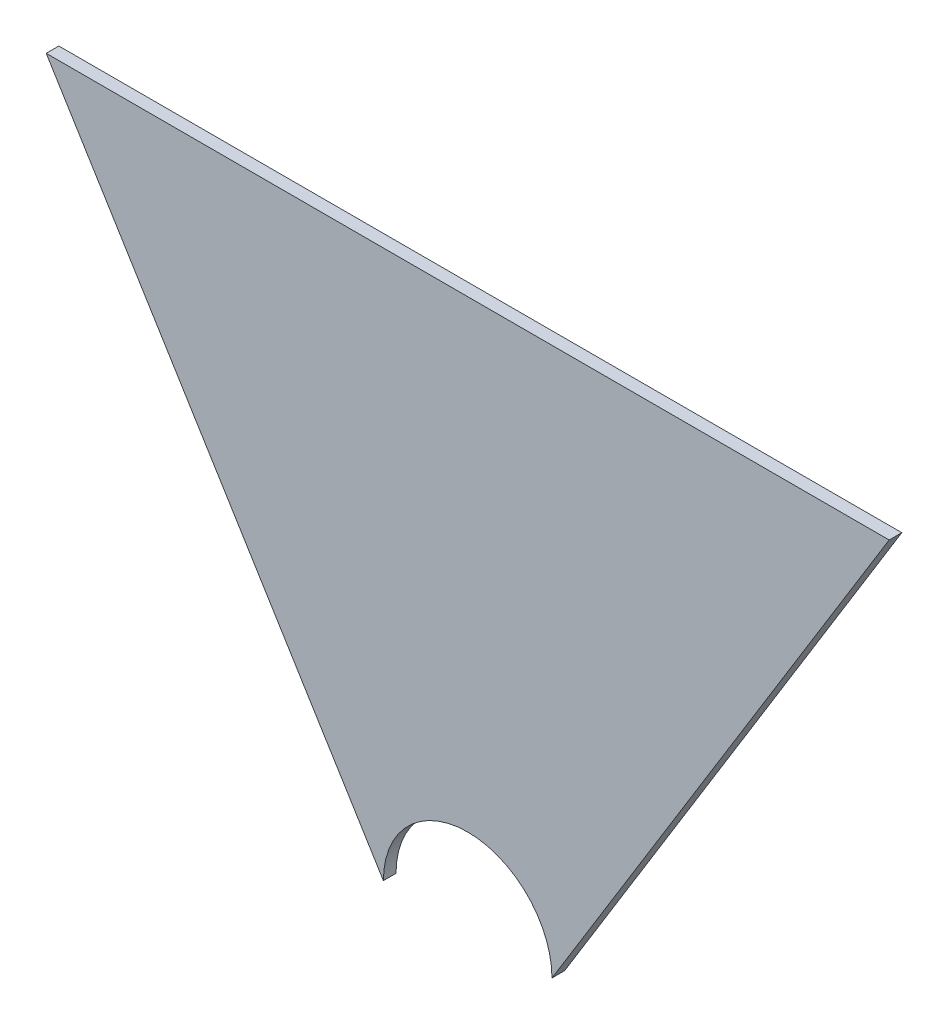
ISO-10303-21;
HEADER;
FILE_DESCRIPTION(('STEP AP214'),'2;1');
FILE_NAME('part.step','',(''),(''),'','','');
FILE_SCHEMA(('AUTOMOTIVE_DESIGN { 1 0 10303 214 1 1 1 1 }'));
ENDSEC;
DATA;
#1=APPLICATION_CONTEXT('core data for automotive mechanical design processes');
#2=APPLICATION_PROTOCOL_DEFINITION('international standard','automotive_design',2000,#1);
#3=PRODUCT_CONTEXT('',#1,'mechanical');
#4=PRODUCT('Part','Part','',(#3));
#5=PRODUCT_RELATED_PRODUCT_CATEGORY('part','',(#4));
#6=PRODUCT_DEFINITION_FORMATION('','',#4);
#7=PRODUCT_DEFINITION_CONTEXT('part definition',#1,'design');
#8=PRODUCT_DEFINITION('design','',#6,#7);
#9=PRODUCT_DEFINITION_SHAPE('','',#8);
#10=(LENGTH_UNIT() NAMED_UNIT(*) SI_UNIT(.MILLI.,.METRE.));
#11=(NAMED_UNIT(*) PLANE_ANGLE_UNIT() SI_UNIT($,.RADIAN.));
#12=(NAMED_UNIT(*) SI_UNIT($,.STERADIAN.) SOLID_ANGLE_UNIT());
#13=UNCERTAINTY_MEASURE_WITH_UNIT(LENGTH_MEASURE(1.E-05),#10,'distance_accuracy_value','');
#14=(GEOMETRIC_REPRESENTATION_CONTEXT(3) GLOBAL_UNCERTAINTY_ASSIGNED_CONTEXT((#13)) GLOBAL_UNIT_ASSIGNED_CONTEXT((#10,
#11,#12)) REPRESENTATION_CONTEXT('',''));
#15=CARTESIAN_POINT('',(0.,0.,0.));
#16=DIRECTION('',(0.,0.,1.));
#17=DIRECTION('',(1.,0.,0.));
#18=AXIS2_PLACEMENT_3D('',#15,#16,#17);
#19=CARTESIAN_POINT('',(80.,-130.,-3.));
#20=DIRECTION('',(-0.851658316704544,-0.524097425664335,0.));
#21=DIRECTION('',(0.524097425664335,-0.851658316704544,0.));
#22=AXIS2_PLACEMENT_3D('',#19,#20,#21);
#23=PLANE('',#22);
#24=DIRECTION('',(0.524097425664335,-0.851658316704544,0.));
#25=VECTOR('',#24,1.);
#26=CARTESIAN_POINT('',(80.,-130.,0.));
#27=LINE('',#26,#25);
#28=CARTESIAN_POINT('',(0.,0.,0.));
#29=VERTEX_POINT('',#28);
#30=CARTESIAN_POINT('',(80.,-130.,0.));
#31=VERTEX_POINT('',#30);
#32=EDGE_CURVE('E103',#29,#31,#27,.T.);
#33=ORIENTED_EDGE('',*,*,#32,.F.);
#34=DIRECTION('',(0.,0.,1.));
#35=VECTOR('',#34,1.);
#36=CARTESIAN_POINT('',(0.,0.,-3.));
#37=LINE('',#36,#35);
#38=CARTESIAN_POINT('',(0.,0.,-3.));
#39=VERTEX_POINT('',#38);
#40=EDGE_CURVE('E11',#39,#29,#37,.T.);
#41=ORIENTED_EDGE('',*,*,#40,.F.);
#42=DIRECTION('',(0.524097425664335,-0.851658316704544,0.));
#43=VECTOR('',#42,1.);
#44=CARTESIAN_POINT('',(80.,-130.,-3.));
#45=LINE('',#44,#43);
#46=CARTESIAN_POINT('',(80.,-130.,-3.));
#47=VERTEX_POINT('',#46);
#48=EDGE_CURVE('E97',#39,#47,#45,.T.);
#49=ORIENTED_EDGE('',*,*,#48,.T.);
#50=DIRECTION('',(0.,0.,1.));
#51=VECTOR('',#50,1.);
#52=CARTESIAN_POINT('',(80.,-130.,-3.));
#53=LINE('',#52,#51);
#54=EDGE_CURVE('E42',#47,#31,#53,.T.);
#55=ORIENTED_EDGE('',*,*,#54,.T.);
#56=EDGE_LOOP('',(#33,#41,#49,#55));
#57=FACE_BOUND('',#56,.T.);
#58=ADVANCED_FACE('F39',(#57),#23,.T.);
#59=CARTESIAN_POINT('',(0.,0.,-3.));
#60=DIRECTION('',(0.,1.,0.));
#61=DIRECTION('',(0.,0.,1.));
#62=AXIS2_PLACEMENT_3D('',#59,#60,#61);
#63=PLANE('',#62);
#64=DIRECTION('',(-1.,0.,0.));
#65=VECTOR('',#64,1.);
#66=CARTESIAN_POINT('',(0.,0.,0.));
#67=LINE('',#66,#65);
#68=CARTESIAN_POINT('',(200.,0.,0.));
#69=VERTEX_POINT('',#68);
#70=EDGE_CURVE('E99',#69,#29,#67,.T.);
#71=ORIENTED_EDGE('',*,*,#70,.F.);
#72=DIRECTION('',(0.,0.,1.));
#73=VECTOR('',#72,1.);
#74=CARTESIAN_POINT('',(200.,0.,-3.));
#75=LINE('',#74,#73);
#76=CARTESIAN_POINT('',(200.,0.,-3.));
#77=VERTEX_POINT('',#76);
#78=EDGE_CURVE('E48',#77,#69,#75,.T.);
#79=ORIENTED_EDGE('',*,*,#78,.F.);
#80=DIRECTION('',(-1.,0.,0.));
#81=VECTOR('',#80,1.);
#82=CARTESIAN_POINT('',(0.,0.,-3.));
#83=LINE('',#82,#81);
#84=EDGE_CURVE('E94',#77,#39,#83,.T.);
#85=ORIENTED_EDGE('',*,*,#84,.T.);
#86=ORIENTED_EDGE('',*,*,#40,.T.);
#87=EDGE_LOOP('',(#71,#79,#85,#86));
#88=FACE_BOUND('',#87,.T.);
#89=ADVANCED_FACE('F113',(#88),#63,.T.);
#90=CARTESIAN_POINT('',(200.,0.,-3.));
#91=DIRECTION('',(0.851658316704544,-0.524097425664335,0.));
#92=DIRECTION('',(0.524097425664335,0.851658316704544,0.));
#93=AXIS2_PLACEMENT_3D('',#90,#91,#92);
#94=PLANE('',#93);
#95=DIRECTION('',(0.524097425664335,0.851658316704544,0.));
#96=VECTOR('',#95,1.);
#97=CARTESIAN_POINT('',(200.,0.,0.));
#98=LINE('',#97,#96);
#99=CARTESIAN_POINT('',(120.,-130.,0.));
#100=VERTEX_POINT('',#99);
#101=EDGE_CURVE('E89',#100,#69,#98,.T.);
#102=ORIENTED_EDGE('',*,*,#101,.F.);
#103=DIRECTION('',(0.,0.,1.));
#104=VECTOR('',#103,1.);
#105=CARTESIAN_POINT('',(120.,-130.,-3.));
#106=LINE('',#105,#104);
#107=CARTESIAN_POINT('',(120.,-130.,-3.));
#108=VERTEX_POINT('',#107);
#109=EDGE_CURVE('E84',#108,#100,#106,.T.);
#110=ORIENTED_EDGE('',*,*,#109,.F.);
#111=DIRECTION('',(0.524097425664335,0.851658316704544,0.));
#112=VECTOR('',#111,1.);
#113=CARTESIAN_POINT('',(200.,0.,-3.));
#114=LINE('',#113,#112);
#115=EDGE_CURVE('E87',#108,#77,#114,.T.);
#116=ORIENTED_EDGE('',*,*,#115,.T.);
#117=ORIENTED_EDGE('',*,*,#78,.T.);
#118=EDGE_LOOP('',(#102,#110,#116,#117));
#119=FACE_BOUND('',#118,.T.);
#120=ADVANCED_FACE('F86',(#119),#94,.T.);
#121=CARTESIAN_POINT('',(100.,-130.,-3.));
#122=DIRECTION('',(0.,0.,1.));
#123=DIRECTION('',(1.,0.,0.));
#124=AXIS2_PLACEMENT_3D('',#121,#122,#123);
#125=CYLINDRICAL_SURFACE('',#124,20.);
#126=CARTESIAN_POINT('',(100.,-130.,0.));
#127=DIRECTION('',(0.,0.,-1.));
#128=DIRECTION('',(1.,0.,0.));
#129=AXIS2_PLACEMENT_3D('',#126,#127,#128);
#130=CIRCLE('',#129,20.);
#131=EDGE_CURVE('E106',#31,#100,#130,.T.);
#132=ORIENTED_EDGE('',*,*,#131,.F.);
#133=ORIENTED_EDGE('',*,*,#54,.F.);
#134=CARTESIAN_POINT('',(100.,-130.,-3.));
#135=DIRECTION('',(0.,0.,-1.));
#136=DIRECTION('',(1.,0.,0.));
#137=AXIS2_PLACEMENT_3D('',#134,#135,#136);
#138=CIRCLE('',#137,20.);
#139=EDGE_CURVE('E93',#47,#108,#138,.T.);
#140=ORIENTED_EDGE('',*,*,#139,.T.);
#141=ORIENTED_EDGE('',*,*,#109,.T.);
#142=EDGE_LOOP('',(#132,#133,#140,#141));
#143=FACE_BOUND('',#142,.T.);
#144=ADVANCED_FACE('F96',(#143),#125,.F.);
#145=CARTESIAN_POINT('',(100.,-130.,-3.));
#146=DIRECTION('',(0.,0.,1.));
#147=DIRECTION('',(1.,0.,0.));
#148=AXIS2_PLACEMENT_3D('',#145,#146,#147);
#149=PLANE('',#148);
#150=ORIENTED_EDGE('',*,*,#48,.F.);
#151=ORIENTED_EDGE('',*,*,#84,.F.);
#152=ORIENTED_EDGE('',*,*,#115,.F.);
#153=ORIENTED_EDGE('',*,*,#139,.F.);
#154=EDGE_LOOP('',(#150,#151,#152,#153));
#155=FACE_BOUND('',#154,.T.);
#156=ADVANCED_FACE('F92',(#155),#149,.F.);
#157=CARTESIAN_POINT('',(100.,-130.,0.));
#158=DIRECTION('',(0.,0.,1.));
#159=DIRECTION('',(1.,0.,0.));
#160=AXIS2_PLACEMENT_3D('',#157,#158,#159);
#161=PLANE('',#160);
#162=ORIENTED_EDGE('',*,*,#32,.T.);
#163=ORIENTED_EDGE('',*,*,#131,.T.);
#164=ORIENTED_EDGE('',*,*,#101,.T.);
#165=ORIENTED_EDGE('',*,*,#70,.T.);
#166=EDGE_LOOP('',(#162,#163,#164,#165));
#167=FACE_BOUND('',#166,.T.);
#168=ADVANCED_FACE('F112',(#167),#161,.T.);
#169=CLOSED_SHELL('',(#58,#89,#120,#144,#156,#168));
#170=MANIFOLD_SOLID_BREP('B2',#169);
#171=ADVANCED_BREP_SHAPE_REPRESENTATION('',(#18,#170),#14);
#172=SHAPE_DEFINITION_REPRESENTATION(#9,#171);
ENDSEC;
END-ISO-10303-21;
